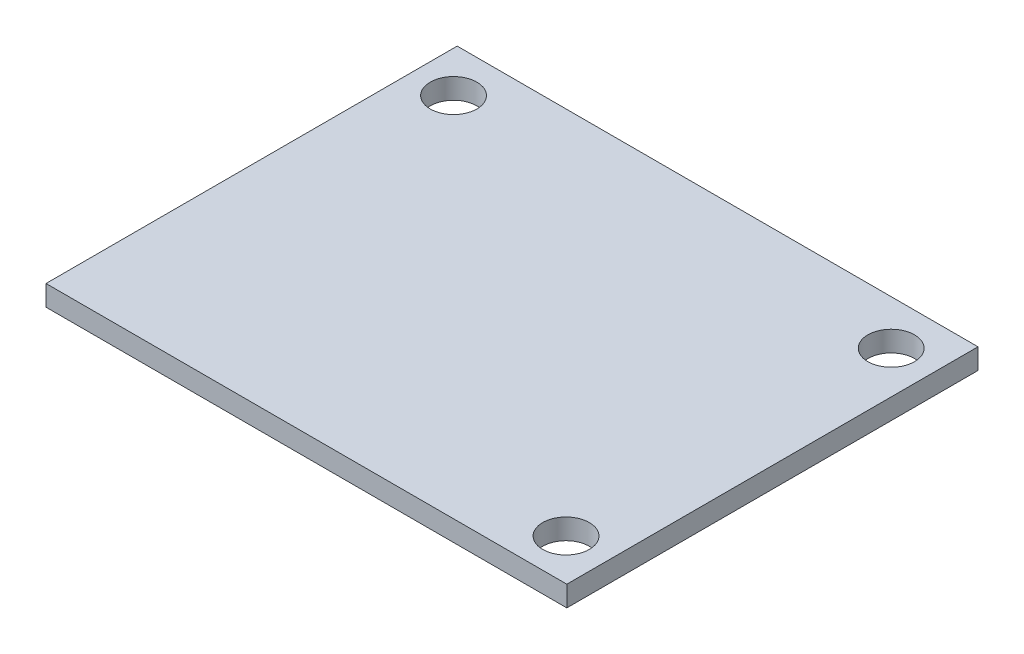
ISO-10303-21;
HEADER;
FILE_DESCRIPTION(('STEP AP214'),'2;1');
FILE_NAME('part.step','',(''),(''),'','','');
FILE_SCHEMA(('AUTOMOTIVE_DESIGN { 1 0 10303 214 1 1 1 1 }'));
ENDSEC;
DATA;
#1=APPLICATION_CONTEXT('core data for automotive mechanical design processes');
#2=APPLICATION_PROTOCOL_DEFINITION('international standard','automotive_design',2000,#1);
#3=PRODUCT_CONTEXT('',#1,'mechanical');
#4=PRODUCT('Part','Part','',(#3));
#5=PRODUCT_RELATED_PRODUCT_CATEGORY('part','',(#4));
#6=PRODUCT_DEFINITION_FORMATION('','',#4);
#7=PRODUCT_DEFINITION_CONTEXT('part definition',#1,'design');
#8=PRODUCT_DEFINITION('design','',#6,#7);
#9=PRODUCT_DEFINITION_SHAPE('','',#8);
#10=(LENGTH_UNIT() NAMED_UNIT(*) SI_UNIT(.MILLI.,.METRE.));
#11=(NAMED_UNIT(*) PLANE_ANGLE_UNIT() SI_UNIT($,.RADIAN.));
#12=(NAMED_UNIT(*) SI_UNIT($,.STERADIAN.) SOLID_ANGLE_UNIT());
#13=UNCERTAINTY_MEASURE_WITH_UNIT(LENGTH_MEASURE(1.E-05),#10,'distance_accuracy_value','');
#14=(GEOMETRIC_REPRESENTATION_CONTEXT(3) GLOBAL_UNCERTAINTY_ASSIGNED_CONTEXT((#13)) GLOBAL_UNIT_ASSIGNED_CONTEXT((#10,
#11,#12)) REPRESENTATION_CONTEXT('',''));
#15=CARTESIAN_POINT('',(0.,0.,0.));
#16=DIRECTION('',(0.,0.,1.));
#17=DIRECTION('',(1.,0.,0.));
#18=AXIS2_PLACEMENT_3D('',#15,#16,#17);
#19=CARTESIAN_POINT('',(19.,1.5,-15.));
#20=DIRECTION('',(-1.,0.,0.));
#21=DIRECTION('',(0.,0.,1.));
#22=AXIS2_PLACEMENT_3D('',#19,#20,#21);
#23=PLANE('',#22);
#24=DIRECTION('',(0.,0.,-1.));
#25=VECTOR('',#24,1.);
#26=CARTESIAN_POINT('',(19.,0.,-15.));
#27=LINE('',#26,#25);
#28=CARTESIAN_POINT('',(19.,0.,15.));
#29=VERTEX_POINT('',#28);
#30=CARTESIAN_POINT('',(19.,0.,-15.));
#31=VERTEX_POINT('',#30);
#32=EDGE_CURVE('E98',#29,#31,#27,.T.);
#33=ORIENTED_EDGE('',*,*,#32,.T.);
#34=DIRECTION('',(0.,-1.,0.));
#35=VECTOR('',#34,1.);
#36=CARTESIAN_POINT('',(19.,1.5,-15.));
#37=LINE('',#36,#35);
#38=CARTESIAN_POINT('',(19.,1.5,-15.));
#39=VERTEX_POINT('',#38);
#40=EDGE_CURVE('E11',#39,#31,#37,.T.);
#41=ORIENTED_EDGE('',*,*,#40,.F.);
#42=DIRECTION('',(0.,0.,-1.));
#43=VECTOR('',#42,1.);
#44=CARTESIAN_POINT('',(19.,1.5,-15.));
#45=LINE('',#44,#43);
#46=CARTESIAN_POINT('',(19.,1.5,15.));
#47=VERTEX_POINT('',#46);
#48=EDGE_CURVE('E86',#47,#39,#45,.T.);
#49=ORIENTED_EDGE('',*,*,#48,.F.);
#50=DIRECTION('',(0.,-1.,0.));
#51=VECTOR('',#50,1.);
#52=CARTESIAN_POINT('',(19.,1.5,15.));
#53=LINE('',#52,#51);
#54=EDGE_CURVE('E94',#47,#29,#53,.T.);
#55=ORIENTED_EDGE('',*,*,#54,.T.);
#56=EDGE_LOOP('',(#33,#41,#49,#55));
#57=FACE_BOUND('',#56,.T.);
#58=ADVANCED_FACE('F35',(#57),#23,.F.);
#59=CARTESIAN_POINT('',(-19.,1.5,-15.));
#60=DIRECTION('',(0.,0.,1.));
#61=DIRECTION('',(1.,0.,0.));
#62=AXIS2_PLACEMENT_3D('',#59,#60,#61);
#63=PLANE('',#62);
#64=DIRECTION('',(-1.,0.,0.));
#65=VECTOR('',#64,1.);
#66=CARTESIAN_POINT('',(-19.,0.,-15.));
#67=LINE('',#66,#65);
#68=CARTESIAN_POINT('',(-19.,0.,-15.));
#69=VERTEX_POINT('',#68);
#70=EDGE_CURVE('E90',#31,#69,#67,.T.);
#71=ORIENTED_EDGE('',*,*,#70,.T.);
#72=DIRECTION('',(0.,-1.,0.));
#73=VECTOR('',#72,1.);
#74=CARTESIAN_POINT('',(-19.,1.5,-15.));
#75=LINE('',#74,#73);
#76=CARTESIAN_POINT('',(-19.,1.5,-15.));
#77=VERTEX_POINT('',#76);
#78=EDGE_CURVE('E43',#77,#69,#75,.T.);
#79=ORIENTED_EDGE('',*,*,#78,.F.);
#80=DIRECTION('',(-1.,0.,0.));
#81=VECTOR('',#80,1.);
#82=CARTESIAN_POINT('',(-19.,1.5,-15.));
#83=LINE('',#82,#81);
#84=EDGE_CURVE('E81',#39,#77,#83,.T.);
#85=ORIENTED_EDGE('',*,*,#84,.F.);
#86=ORIENTED_EDGE('',*,*,#40,.T.);
#87=EDGE_LOOP('',(#71,#79,#85,#86));
#88=FACE_BOUND('',#87,.T.);
#89=ADVANCED_FACE('F89',(#88),#63,.F.);
#90=CARTESIAN_POINT('',(-19.,1.5,-15.));
#91=DIRECTION('',(1.,0.,0.));
#92=DIRECTION('',(0.,0.,-1.));
#93=AXIS2_PLACEMENT_3D('',#90,#91,#92);
#94=PLANE('',#93);
#95=DIRECTION('',(0.,0.,1.));
#96=VECTOR('',#95,1.);
#97=CARTESIAN_POINT('',(-19.,0.,-15.));
#98=LINE('',#97,#96);
#99=CARTESIAN_POINT('',(-19.,0.,15.));
#100=VERTEX_POINT('',#99);
#101=EDGE_CURVE('E68',#69,#100,#98,.T.);
#102=ORIENTED_EDGE('',*,*,#101,.T.);
#103=DIRECTION('',(0.,-1.,0.));
#104=VECTOR('',#103,1.);
#105=CARTESIAN_POINT('',(-19.,1.5,15.));
#106=LINE('',#105,#104);
#107=CARTESIAN_POINT('',(-19.,1.5,15.));
#108=VERTEX_POINT('',#107);
#109=EDGE_CURVE('E91',#108,#100,#106,.T.);
#110=ORIENTED_EDGE('',*,*,#109,.F.);
#111=DIRECTION('',(0.,0.,1.));
#112=VECTOR('',#111,1.);
#113=CARTESIAN_POINT('',(-19.,1.5,-15.));
#114=LINE('',#113,#112);
#115=EDGE_CURVE('E84',#77,#108,#114,.T.);
#116=ORIENTED_EDGE('',*,*,#115,.F.);
#117=ORIENTED_EDGE('',*,*,#78,.T.);
#118=EDGE_LOOP('',(#102,#110,#116,#117));
#119=FACE_BOUND('',#118,.T.);
#120=ADVANCED_FACE('F92',(#119),#94,.F.);
#121=CARTESIAN_POINT('',(-19.,1.5,15.));
#122=DIRECTION('',(0.,0.,-1.));
#123=DIRECTION('',(-1.,0.,0.));
#124=AXIS2_PLACEMENT_3D('',#121,#122,#123);
#125=PLANE('',#124);
#126=DIRECTION('',(1.,0.,0.));
#127=VECTOR('',#126,1.);
#128=CARTESIAN_POINT('',(-19.,0.,15.));
#129=LINE('',#128,#127);
#130=EDGE_CURVE('E74',#100,#29,#129,.T.);
#131=ORIENTED_EDGE('',*,*,#130,.T.);
#132=ORIENTED_EDGE('',*,*,#54,.F.);
#133=DIRECTION('',(1.,0.,0.));
#134=VECTOR('',#133,1.);
#135=CARTESIAN_POINT('',(-19.,1.5,15.));
#136=LINE('',#135,#134);
#137=EDGE_CURVE('E51',#108,#47,#136,.T.);
#138=ORIENTED_EDGE('',*,*,#137,.F.);
#139=ORIENTED_EDGE('',*,*,#109,.T.);
#140=EDGE_LOOP('',(#131,#132,#138,#139));
#141=FACE_BOUND('',#140,.T.);
#142=ADVANCED_FACE('F106',(#141),#125,.F.);
#143=CARTESIAN_POINT('',(0.,1.5,0.));
#144=DIRECTION('',(0.,1.,0.));
#145=DIRECTION('',(0.,0.,1.));
#146=AXIS2_PLACEMENT_3D('',#143,#144,#145);
#147=PLANE('',#146);
#148=CARTESIAN_POINT('',(15.9255000718178,1.5,11.984545104807));
#149=DIRECTION('',(0.,1.,0.));
#150=DIRECTION('',(0.,0.,1.));
#151=AXIS2_PLACEMENT_3D('',#148,#149,#150);
#152=CIRCLE('',#151,1.7);
#153=CARTESIAN_POINT('',(15.9255000718178,1.5,13.684545104807));
#154=VERTEX_POINT('',#153);
#155=EDGE_CURVE('E124',#154,#154,#152,.T.);
#156=ORIENTED_EDGE('',*,*,#155,.F.);
#157=EDGE_LOOP('',(#156));
#158=FACE_BOUND('',#157,.T.);
#159=CARTESIAN_POINT('',(15.9255000718178,1.5,-11.7420247991448));
#160=DIRECTION('',(0.,1.,0.));
#161=DIRECTION('',(0.,0.,1.));
#162=AXIS2_PLACEMENT_3D('',#159,#160,#161);
#163=CIRCLE('',#162,1.7);
#164=CARTESIAN_POINT('',(15.9255000718178,1.5,-10.0420247991448));
#165=VERTEX_POINT('',#164);
#166=EDGE_CURVE('E118',#165,#165,#163,.T.);
#167=ORIENTED_EDGE('',*,*,#166,.F.);
#168=EDGE_LOOP('',(#167));
#169=FACE_BOUND('',#168,.T.);
#170=CARTESIAN_POINT('',(-16.0063401737052,1.5,-11.7420247991448));
#171=DIRECTION('',(0.,1.,0.));
#172=DIRECTION('',(0.,0.,1.));
#173=AXIS2_PLACEMENT_3D('',#170,#171,#172);
#174=CIRCLE('',#173,1.7);
#175=CARTESIAN_POINT('',(-16.0063401737052,1.5,-10.0420247991448));
#176=VERTEX_POINT('',#175);
#177=EDGE_CURVE('E112',#176,#176,#174,.T.);
#178=ORIENTED_EDGE('',*,*,#177,.F.);
#179=EDGE_LOOP('',(#178));
#180=FACE_BOUND('',#179,.T.);
#181=ORIENTED_EDGE('',*,*,#48,.T.);
#182=ORIENTED_EDGE('',*,*,#84,.T.);
#183=ORIENTED_EDGE('',*,*,#115,.T.);
#184=ORIENTED_EDGE('',*,*,#137,.T.);
#185=EDGE_LOOP('',(#181,#182,#183,#184));
#186=FACE_BOUND('',#185,.T.);
#187=ADVANCED_FACE('F82',(#158,#169,#180,#186),#147,.T.);
#188=CARTESIAN_POINT('',(0.,0.,0.));
#189=DIRECTION('',(0.,1.,0.));
#190=DIRECTION('',(0.,0.,1.));
#191=AXIS2_PLACEMENT_3D('',#188,#189,#190);
#192=PLANE('',#191);
#193=CARTESIAN_POINT('',(15.9255000718178,0.,11.984545104807));
#194=DIRECTION('',(0.,1.,0.));
#195=DIRECTION('',(0.,0.,1.));
#196=AXIS2_PLACEMENT_3D('',#193,#194,#195);
#197=CIRCLE('',#196,1.7);
#198=CARTESIAN_POINT('',(15.9255000718178,0.,13.684545104807));
#199=VERTEX_POINT('',#198);
#200=EDGE_CURVE('E121',#199,#199,#197,.T.);
#201=ORIENTED_EDGE('',*,*,#200,.T.);
#202=EDGE_LOOP('',(#201));
#203=FACE_BOUND('',#202,.T.);
#204=CARTESIAN_POINT('',(15.9255000718178,0.,-11.7420247991448));
#205=DIRECTION('',(0.,1.,0.));
#206=DIRECTION('',(0.,0.,1.));
#207=AXIS2_PLACEMENT_3D('',#204,#205,#206);
#208=CIRCLE('',#207,1.7);
#209=CARTESIAN_POINT('',(15.9255000718178,0.,-10.0420247991448));
#210=VERTEX_POINT('',#209);
#211=EDGE_CURVE('E115',#210,#210,#208,.T.);
#212=ORIENTED_EDGE('',*,*,#211,.T.);
#213=EDGE_LOOP('',(#212));
#214=FACE_BOUND('',#213,.T.);
#215=CARTESIAN_POINT('',(-16.0063401737052,0.,-11.7420247991448));
#216=DIRECTION('',(0.,1.,0.));
#217=DIRECTION('',(0.,0.,1.));
#218=AXIS2_PLACEMENT_3D('',#215,#216,#217);
#219=CIRCLE('',#218,1.7);
#220=CARTESIAN_POINT('',(-16.0063401737052,0.,-10.0420247991448));
#221=VERTEX_POINT('',#220);
#222=EDGE_CURVE('E101',#221,#221,#219,.T.);
#223=ORIENTED_EDGE('',*,*,#222,.T.);
#224=EDGE_LOOP('',(#223));
#225=FACE_BOUND('',#224,.T.);
#226=ORIENTED_EDGE('',*,*,#32,.F.);
#227=ORIENTED_EDGE('',*,*,#130,.F.);
#228=ORIENTED_EDGE('',*,*,#101,.F.);
#229=ORIENTED_EDGE('',*,*,#70,.F.);
#230=EDGE_LOOP('',(#226,#227,#228,#229));
#231=FACE_BOUND('',#230,.T.);
#232=ADVANCED_FACE('F109',(#203,#214,#225,#231),#192,.F.);
#233=CARTESIAN_POINT('',(-16.0063401737052,0.,-11.7420247991448));
#234=DIRECTION('',(0.,1.,0.));
#235=DIRECTION('',(0.,0.,1.));
#236=AXIS2_PLACEMENT_3D('',#233,#234,#235);
#237=CYLINDRICAL_SURFACE('',#236,1.7);
#238=ORIENTED_EDGE('',*,*,#222,.F.);
#239=EDGE_LOOP('',(#238));
#240=FACE_BOUND('',#239,.T.);
#241=ORIENTED_EDGE('',*,*,#177,.T.);
#242=EDGE_LOOP('',(#241));
#243=FACE_BOUND('',#242,.T.);
#244=ADVANCED_FACE('F146',(#240,#243),#237,.F.);
#245=CARTESIAN_POINT('',(15.9255000718178,0.,-11.7420247991448));
#246=DIRECTION('',(0.,1.,0.));
#247=DIRECTION('',(0.,0.,1.));
#248=AXIS2_PLACEMENT_3D('',#245,#246,#247);
#249=CYLINDRICAL_SURFACE('',#248,1.7);
#250=ORIENTED_EDGE('',*,*,#211,.F.);
#251=EDGE_LOOP('',(#250));
#252=FACE_BOUND('',#251,.T.);
#253=ORIENTED_EDGE('',*,*,#166,.T.);
#254=EDGE_LOOP('',(#253));
#255=FACE_BOUND('',#254,.T.);
#256=ADVANCED_FACE('F135',(#252,#255),#249,.F.);
#257=CARTESIAN_POINT('',(15.9255000718178,0.,11.984545104807));
#258=DIRECTION('',(0.,1.,0.));
#259=DIRECTION('',(0.,0.,1.));
#260=AXIS2_PLACEMENT_3D('',#257,#258,#259);
#261=CYLINDRICAL_SURFACE('',#260,1.7);
#262=ORIENTED_EDGE('',*,*,#200,.F.);
#263=EDGE_LOOP('',(#262));
#264=FACE_BOUND('',#263,.T.);
#265=ORIENTED_EDGE('',*,*,#155,.T.);
#266=EDGE_LOOP('',(#265));
#267=FACE_BOUND('',#266,.T.);
#268=ADVANCED_FACE('F132',(#264,#267),#261,.F.);
#269=CLOSED_SHELL('',(#58,#89,#120,#142,#187,#232,#244,#256,#268));
#270=MANIFOLD_SOLID_BREP('B2',#269);
#271=ADVANCED_BREP_SHAPE_REPRESENTATION('',(#18,#270),#14);
#272=SHAPE_DEFINITION_REPRESENTATION(#9,#271);
ENDSEC;
END-ISO-10303-21;
